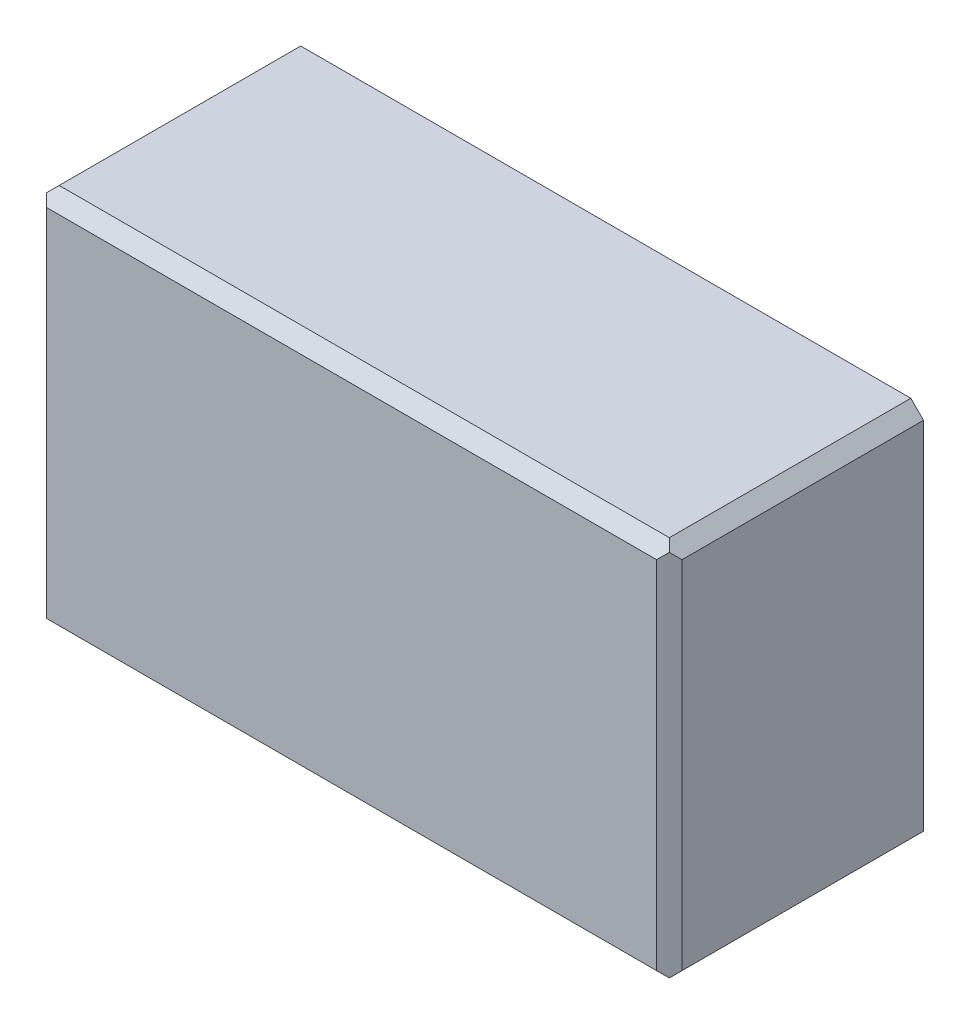
ISO-10303-21;
HEADER;
FILE_DESCRIPTION(('STEP AP214'),'2;1');
FILE_NAME('part.step','',(''),(''),'','','');
FILE_SCHEMA(('AUTOMOTIVE_DESIGN { 1 0 10303 214 1 1 1 1 }'));
ENDSEC;
DATA;
#1=APPLICATION_CONTEXT('core data for automotive mechanical design processes');
#2=APPLICATION_PROTOCOL_DEFINITION('international standard','automotive_design',2000,#1);
#3=PRODUCT_CONTEXT('',#1,'mechanical');
#4=PRODUCT('Part','Part','',(#3));
#5=PRODUCT_RELATED_PRODUCT_CATEGORY('part','',(#4));
#6=PRODUCT_DEFINITION_FORMATION('','',#4);
#7=PRODUCT_DEFINITION_CONTEXT('part definition',#1,'design');
#8=PRODUCT_DEFINITION('design','',#6,#7);
#9=PRODUCT_DEFINITION_SHAPE('','',#8);
#10=(LENGTH_UNIT() NAMED_UNIT(*) SI_UNIT(.MILLI.,.METRE.));
#11=(NAMED_UNIT(*) PLANE_ANGLE_UNIT() SI_UNIT($,.RADIAN.));
#12=(NAMED_UNIT(*) SI_UNIT($,.STERADIAN.) SOLID_ANGLE_UNIT());
#13=UNCERTAINTY_MEASURE_WITH_UNIT(LENGTH_MEASURE(1.E-05),#10,'distance_accuracy_value','');
#14=(GEOMETRIC_REPRESENTATION_CONTEXT(3) GLOBAL_UNCERTAINTY_ASSIGNED_CONTEXT((#13)) GLOBAL_UNIT_ASSIGNED_CONTEXT((#10,
#11,#12)) REPRESENTATION_CONTEXT('',''));
#15=CARTESIAN_POINT('',(0.,0.,0.));
#16=DIRECTION('',(0.,0.,1.));
#17=DIRECTION('',(1.,0.,0.));
#18=AXIS2_PLACEMENT_3D('',#15,#16,#17);
#19=CARTESIAN_POINT('',(0.,0.,0.0862));
#20=DIRECTION('',(0.,0.,-1.));
#21=DIRECTION('',(-1.,0.,0.));
#22=AXIS2_PLACEMENT_3D('',#19,#20,#21);
#23=PLANE('',#22);
#24=DIRECTION('',(1.,0.,0.));
#25=VECTOR('',#24,1.);
#26=CARTESIAN_POINT('',(-0.4159973957868,0.25,0.0862));
#27=LINE('',#26,#25);
#28=CARTESIAN_POINT('',(-0.2159973957868,0.25,0.0862));
#29=VERTEX_POINT('',#28);
#30=CARTESIAN_POINT('',(-0.4159973957868,0.25,0.0862));
#31=VERTEX_POINT('',#30);
#32=EDGE_CURVE('E184',#29,#31,#27,.F.);
#33=ORIENTED_EDGE('',*,*,#32,.F.);
#34=DIRECTION('',(0.,1.,0.));
#35=VECTOR('',#34,1.);
#36=CARTESIAN_POINT('',(-0.2159973957868,0.25,0.0862));
#37=LINE('',#36,#35);
#38=CARTESIAN_POINT('',(-0.2159973957868,-0.25,0.0862));
#39=VERTEX_POINT('',#38);
#40=EDGE_CURVE('E212',#39,#29,#37,.T.);
#41=ORIENTED_EDGE('',*,*,#40,.F.);
#42=DIRECTION('',(1.,0.,0.));
#43=VECTOR('',#42,1.);
#44=CARTESIAN_POINT('',(-0.2159973957868,-0.25,0.0862));
#45=LINE('',#44,#43);
#46=CARTESIAN_POINT('',(-0.4659973957868,-0.25,0.0862));
#47=VERTEX_POINT('',#46);
#48=EDGE_CURVE('E163',#47,#39,#45,.T.);
#49=ORIENTED_EDGE('',*,*,#48,.F.);
#50=DIRECTION('',(0.,1.,0.));
#51=VECTOR('',#50,1.);
#52=CARTESIAN_POINT('',(-0.4659973957868,-0.25,0.0862));
#53=LINE('',#52,#51);
#54=CARTESIAN_POINT('',(-0.4659973957868,0.2,0.0862));
#55=VERTEX_POINT('',#54);
#56=EDGE_CURVE('E157',#55,#47,#53,.F.);
#57=ORIENTED_EDGE('',*,*,#56,.F.);
#58=CARTESIAN_POINT('',(-0.4659973957868,0.25,0.0862));
#59=DIRECTION('',(0.,0.,-1.));
#60=DIRECTION('',(-1.,0.,0.));
#61=AXIS2_PLACEMENT_3D('',#58,#59,#60);
#62=CIRCLE('',#61,0.05);
#63=EDGE_CURVE('E20',#55,#31,#62,.F.);
#64=ORIENTED_EDGE('',*,*,#63,.T.);
#65=EDGE_LOOP('',(#33,#41,#49,#57,#64));
#66=FACE_BOUND('',#65,.T.);
#67=ADVANCED_FACE('F17',(#66),#23,.T.);
#68=CARTESIAN_POINT('',(0.,0.,0.0862));
#69=DIRECTION('',(0.,0.,-1.));
#70=DIRECTION('',(-1.,0.,0.));
#71=AXIS2_PLACEMENT_3D('',#68,#69,#70);
#72=PLANE('',#71);
#73=DIRECTION('',(1.,0.,0.));
#74=VECTOR('',#73,1.);
#75=CARTESIAN_POINT('',(0.1840026042132,0.25,0.0862));
#76=LINE('',#75,#74);
#77=CARTESIAN_POINT('',(0.4340026042132,0.25,0.0862));
#78=VERTEX_POINT('',#77);
#79=CARTESIAN_POINT('',(0.1840026042132,0.25,0.0862));
#80=VERTEX_POINT('',#79);
#81=EDGE_CURVE('E232',#78,#80,#76,.F.);
#82=ORIENTED_EDGE('',*,*,#81,.F.);
#83=DIRECTION('',(0.,1.,0.));
#84=VECTOR('',#83,1.);
#85=CARTESIAN_POINT('',(0.4340026042132,0.25,0.0862));
#86=LINE('',#85,#84);
#87=CARTESIAN_POINT('',(0.4340026042132,-0.25,0.0862));
#88=VERTEX_POINT('',#87);
#89=EDGE_CURVE('E249',#88,#78,#86,.T.);
#90=ORIENTED_EDGE('',*,*,#89,.F.);
#91=DIRECTION('',(1.,0.,0.));
#92=VECTOR('',#91,1.);
#93=CARTESIAN_POINT('',(0.4340026042132,-0.25,0.0862));
#94=LINE('',#93,#92);
#95=CARTESIAN_POINT('',(0.1840026042132,-0.25,0.0862));
#96=VERTEX_POINT('',#95);
#97=EDGE_CURVE('E247',#96,#88,#94,.T.);
#98=ORIENTED_EDGE('',*,*,#97,.F.);
#99=DIRECTION('',(0.,1.,0.));
#100=VECTOR('',#99,1.);
#101=CARTESIAN_POINT('',(0.1840026042132,-0.25,0.0862));
#102=LINE('',#101,#100);
#103=EDGE_CURVE('E241',#80,#96,#102,.F.);
#104=ORIENTED_EDGE('',*,*,#103,.F.);
#105=EDGE_LOOP('',(#82,#90,#98,#104));
#106=FACE_BOUND('',#105,.T.);
#107=ADVANCED_FACE('F273',(#106),#72,.T.);
#108=CARTESIAN_POINT('',(-0.2159973957868,0.25,0.1262));
#109=DIRECTION('',(1.,0.,0.));
#110=DIRECTION('',(0.,0.,-1.));
#111=AXIS2_PLACEMENT_3D('',#108,#109,#110);
#112=PLANE('',#111);
#113=DIRECTION('',(0.,0.,1.));
#114=VECTOR('',#113,1.);
#115=CARTESIAN_POINT('',(-0.2159973957868,0.25,0.1262));
#116=LINE('',#115,#114);
#117=CARTESIAN_POINT('',(-0.2159973957868,0.25,0.1262));
#118=VERTEX_POINT('',#117);
#119=EDGE_CURVE('E182',#118,#29,#116,.F.);
#120=ORIENTED_EDGE('',*,*,#119,.F.);
#121=DIRECTION('',(0.,1.,0.));
#122=VECTOR('',#121,1.);
#123=CARTESIAN_POINT('',(-0.2159973957868,0.,0.1262));
#124=LINE('',#123,#122);
#125=CARTESIAN_POINT('',(-0.2159973957868,-0.25,0.1262));
#126=VERTEX_POINT('',#125);
#127=EDGE_CURVE('E194',#118,#126,#124,.F.);
#128=ORIENTED_EDGE('',*,*,#127,.T.);
#129=DIRECTION('',(0.,0.,-1.));
#130=VECTOR('',#129,1.);
#131=CARTESIAN_POINT('',(-0.2159973957868,-0.25,0.1262));
#132=LINE('',#131,#130);
#133=EDGE_CURVE('E168',#39,#126,#132,.F.);
#134=ORIENTED_EDGE('',*,*,#133,.F.);
#135=ORIENTED_EDGE('',*,*,#40,.T.);
#136=EDGE_LOOP('',(#120,#128,#134,#135));
#137=FACE_BOUND('',#136,.T.);
#138=ADVANCED_FACE('F262',(#137),#112,.T.);
#139=CARTESIAN_POINT('',(-0.2159973957868,-0.25,0.1262));
#140=DIRECTION('',(0.,-1.,0.));
#141=DIRECTION('',(0.,0.,-1.));
#142=AXIS2_PLACEMENT_3D('',#139,#140,#141);
#143=PLANE('',#142);
#144=ORIENTED_EDGE('',*,*,#133,.T.);
#145=DIRECTION('',(1.,0.,0.));
#146=VECTOR('',#145,1.);
#147=CARTESIAN_POINT('',(0.,-0.25,0.1262));
#148=LINE('',#147,#146);
#149=CARTESIAN_POINT('',(-0.4659973957868,-0.25,0.1262));
#150=VERTEX_POINT('',#149);
#151=EDGE_CURVE('E196',#126,#150,#148,.F.);
#152=ORIENTED_EDGE('',*,*,#151,.T.);
#153=DIRECTION('',(0.,0.,1.));
#154=VECTOR('',#153,1.);
#155=CARTESIAN_POINT('',(-0.4659973957868,-0.25,0.1262));
#156=LINE('',#155,#154);
#157=EDGE_CURVE('E167',#47,#150,#156,.T.);
#158=ORIENTED_EDGE('',*,*,#157,.F.);
#159=ORIENTED_EDGE('',*,*,#48,.T.);
#160=EDGE_LOOP('',(#144,#152,#158,#159));
#161=FACE_BOUND('',#160,.T.);
#162=ADVANCED_FACE('F264',(#161),#143,.T.);
#163=CARTESIAN_POINT('',(-0.4659973957868,-0.25,0.1262));
#164=DIRECTION('',(-1.,0.,0.));
#165=DIRECTION('',(0.,0.,1.));
#166=AXIS2_PLACEMENT_3D('',#163,#164,#165);
#167=PLANE('',#166);
#168=ORIENTED_EDGE('',*,*,#157,.T.);
#169=DIRECTION('',(0.,1.,0.));
#170=VECTOR('',#169,1.);
#171=CARTESIAN_POINT('',(-0.4659973957868,0.,0.1262));
#172=LINE('',#171,#170);
#173=CARTESIAN_POINT('',(-0.4659973957868,0.2,0.1262));
#174=VERTEX_POINT('',#173);
#175=EDGE_CURVE('E174',#150,#174,#172,.T.);
#176=ORIENTED_EDGE('',*,*,#175,.T.);
#177=DIRECTION('',(0.,0.,-1.));
#178=VECTOR('',#177,1.);
#179=CARTESIAN_POINT('',(-0.4659973957868,0.2,0.1262));
#180=LINE('',#179,#178);
#181=EDGE_CURVE('E171',#174,#55,#180,.T.);
#182=ORIENTED_EDGE('',*,*,#181,.T.);
#183=ORIENTED_EDGE('',*,*,#56,.T.);
#184=EDGE_LOOP('',(#168,#176,#182,#183));
#185=FACE_BOUND('',#184,.T.);
#186=ADVANCED_FACE('F172',(#185),#167,.T.);
#187=CARTESIAN_POINT('',(-0.4659973957868,0.25,0.1262));
#188=DIRECTION('',(0.,0.,-1.));
#189=DIRECTION('',(-1.,0.,0.));
#190=AXIS2_PLACEMENT_3D('',#187,#188,#189);
#191=CYLINDRICAL_SURFACE('',#190,0.05);
#192=ORIENTED_EDGE('',*,*,#63,.F.);
#193=ORIENTED_EDGE('',*,*,#181,.F.);
#194=CARTESIAN_POINT('',(-0.4659973957868,0.25,0.1262));
#195=DIRECTION('',(0.,0.,-1.));
#196=DIRECTION('',(-1.,0.,0.));
#197=AXIS2_PLACEMENT_3D('',#194,#195,#196);
#198=CIRCLE('',#197,0.05);
#199=CARTESIAN_POINT('',(-0.4159973957868,0.25,0.1262));
#200=VERTEX_POINT('',#199);
#201=EDGE_CURVE('E220',#174,#200,#198,.F.);
#202=ORIENTED_EDGE('',*,*,#201,.T.);
#203=DIRECTION('',(0.,0.,1.));
#204=VECTOR('',#203,1.);
#205=CARTESIAN_POINT('',(-0.4159973957868,0.25,0.1262));
#206=LINE('',#205,#204);
#207=EDGE_CURVE('E180',#31,#200,#206,.T.);
#208=ORIENTED_EDGE('',*,*,#207,.F.);
#209=EDGE_LOOP('',(#192,#193,#202,#208));
#210=FACE_BOUND('',#209,.T.);
#211=ADVANCED_FACE('F178',(#210),#191,.F.);
#212=CARTESIAN_POINT('',(-0.4159973957868,0.25,0.1262));
#213=DIRECTION('',(0.,1.,0.));
#214=DIRECTION('',(0.,0.,1.));
#215=AXIS2_PLACEMENT_3D('',#212,#213,#214);
#216=PLANE('',#215);
#217=ORIENTED_EDGE('',*,*,#207,.T.);
#218=DIRECTION('',(1.,0.,0.));
#219=VECTOR('',#218,1.);
#220=CARTESIAN_POINT('',(0.,0.25,0.1262));
#221=LINE('',#220,#219);
#222=EDGE_CURVE('E221',#200,#118,#221,.T.);
#223=ORIENTED_EDGE('',*,*,#222,.T.);
#224=ORIENTED_EDGE('',*,*,#119,.T.);
#225=ORIENTED_EDGE('',*,*,#32,.T.);
#226=EDGE_LOOP('',(#217,#223,#224,#225));
#227=FACE_BOUND('',#226,.T.);
#228=ADVANCED_FACE('F254',(#227),#216,.T.);
#229=CARTESIAN_POINT('',(0.4340026042132,0.25,0.1262));
#230=DIRECTION('',(1.,0.,0.));
#231=DIRECTION('',(0.,0.,-1.));
#232=AXIS2_PLACEMENT_3D('',#229,#230,#231);
#233=PLANE('',#232);
#234=DIRECTION('',(0.,0.,1.));
#235=VECTOR('',#234,1.);
#236=CARTESIAN_POINT('',(0.4340026042132,0.25,0.1262));
#237=LINE('',#236,#235);
#238=CARTESIAN_POINT('',(0.4340026042132,0.25,0.1262));
#239=VERTEX_POINT('',#238);
#240=EDGE_CURVE('E235',#239,#78,#237,.F.);
#241=ORIENTED_EDGE('',*,*,#240,.F.);
#242=DIRECTION('',(0.,1.,0.));
#243=VECTOR('',#242,1.);
#244=CARTESIAN_POINT('',(0.4340026042132,0.,0.1262));
#245=LINE('',#244,#243);
#246=CARTESIAN_POINT('',(0.4340026042132,-0.25,0.1262));
#247=VERTEX_POINT('',#246);
#248=EDGE_CURVE('E222',#239,#247,#245,.F.);
#249=ORIENTED_EDGE('',*,*,#248,.T.);
#250=DIRECTION('',(0.,0.,-1.));
#251=VECTOR('',#250,1.);
#252=CARTESIAN_POINT('',(0.4340026042132,-0.25,0.1262));
#253=LINE('',#252,#251);
#254=EDGE_CURVE('E244',#88,#247,#253,.F.);
#255=ORIENTED_EDGE('',*,*,#254,.F.);
#256=ORIENTED_EDGE('',*,*,#89,.T.);
#257=EDGE_LOOP('',(#241,#249,#255,#256));
#258=FACE_BOUND('',#257,.T.);
#259=ADVANCED_FACE('F344',(#258),#233,.T.);
#260=CARTESIAN_POINT('',(0.4340026042132,-0.25,0.1262));
#261=DIRECTION('',(0.,-1.,0.));
#262=DIRECTION('',(0.,0.,-1.));
#263=AXIS2_PLACEMENT_3D('',#260,#261,#262);
#264=PLANE('',#263);
#265=ORIENTED_EDGE('',*,*,#254,.T.);
#266=DIRECTION('',(1.,0.,0.));
#267=VECTOR('',#266,1.);
#268=CARTESIAN_POINT('',(0.,-0.25,0.1262));
#269=LINE('',#268,#267);
#270=CARTESIAN_POINT('',(0.1840026042132,-0.25,0.1262));
#271=VERTEX_POINT('',#270);
#272=EDGE_CURVE('E513',#247,#271,#269,.F.);
#273=ORIENTED_EDGE('',*,*,#272,.T.);
#274=DIRECTION('',(0.,0.,1.));
#275=VECTOR('',#274,1.);
#276=CARTESIAN_POINT('',(0.1840026042132,-0.25,0.1262));
#277=LINE('',#276,#275);
#278=EDGE_CURVE('E238',#96,#271,#277,.T.);
#279=ORIENTED_EDGE('',*,*,#278,.F.);
#280=ORIENTED_EDGE('',*,*,#97,.T.);
#281=EDGE_LOOP('',(#265,#273,#279,#280));
#282=FACE_BOUND('',#281,.T.);
#283=ADVANCED_FACE('F340',(#282),#264,.T.);
#284=CARTESIAN_POINT('',(0.1840026042132,-0.25,0.1262));
#285=DIRECTION('',(-1.,0.,0.));
#286=DIRECTION('',(0.,0.,1.));
#287=AXIS2_PLACEMENT_3D('',#284,#285,#286);
#288=PLANE('',#287);
#289=ORIENTED_EDGE('',*,*,#278,.T.);
#290=DIRECTION('',(0.,1.,0.));
#291=VECTOR('',#290,1.);
#292=CARTESIAN_POINT('',(0.1840026042132,0.,0.1262));
#293=LINE('',#292,#291);
#294=CARTESIAN_POINT('',(0.1840026042132,0.25,0.1262));
#295=VERTEX_POINT('',#294);
#296=EDGE_CURVE('E517',#271,#295,#293,.T.);
#297=ORIENTED_EDGE('',*,*,#296,.T.);
#298=DIRECTION('',(0.,0.,1.));
#299=VECTOR('',#298,1.);
#300=CARTESIAN_POINT('',(0.1840026042132,0.25,0.1262));
#301=LINE('',#300,#299);
#302=EDGE_CURVE('E197',#80,#295,#301,.T.);
#303=ORIENTED_EDGE('',*,*,#302,.F.);
#304=ORIENTED_EDGE('',*,*,#103,.T.);
#305=EDGE_LOOP('',(#289,#297,#303,#304));
#306=FACE_BOUND('',#305,.T.);
#307=ADVANCED_FACE('F336',(#306),#288,.T.);
#308=CARTESIAN_POINT('',(0.1840026042132,0.25,0.1262));
#309=DIRECTION('',(0.,1.,0.));
#310=DIRECTION('',(0.,0.,1.));
#311=AXIS2_PLACEMENT_3D('',#308,#309,#310);
#312=PLANE('',#311);
#313=ORIENTED_EDGE('',*,*,#302,.T.);
#314=DIRECTION('',(1.,0.,0.));
#315=VECTOR('',#314,1.);
#316=CARTESIAN_POINT('',(0.,0.25,0.1262));
#317=LINE('',#316,#315);
#318=EDGE_CURVE('E510',#295,#239,#317,.T.);
#319=ORIENTED_EDGE('',*,*,#318,.T.);
#320=ORIENTED_EDGE('',*,*,#240,.T.);
#321=ORIENTED_EDGE('',*,*,#81,.T.);
#322=EDGE_LOOP('',(#313,#319,#320,#321));
#323=FACE_BOUND('',#322,.T.);
#324=ADVANCED_FACE('F332',(#323),#312,.T.);
#325=CARTESIAN_POINT('',(0.,0.,0.1262));
#326=DIRECTION('',(0.,0.,1.));
#327=DIRECTION('',(1.,0.,0.));
#328=AXIS2_PLACEMENT_3D('',#325,#326,#327);
#329=PLANE('',#328);
#330=ORIENTED_EDGE('',*,*,#296,.F.);
#331=ORIENTED_EDGE('',*,*,#272,.F.);
#332=ORIENTED_EDGE('',*,*,#248,.F.);
#333=ORIENTED_EDGE('',*,*,#318,.F.);
#334=EDGE_LOOP('',(#330,#331,#332,#333));
#335=FACE_BOUND('',#334,.T.);
#336=ORIENTED_EDGE('',*,*,#201,.F.);
#337=ORIENTED_EDGE('',*,*,#175,.F.);
#338=ORIENTED_EDGE('',*,*,#151,.F.);
#339=ORIENTED_EDGE('',*,*,#127,.F.);
#340=ORIENTED_EDGE('',*,*,#222,.F.);
#341=EDGE_LOOP('',(#336,#337,#338,#339,#340));
#342=FACE_BOUND('',#341,.T.);
#343=DIRECTION('',(0.707106781186548,0.707106781186548,0.));
#344=VECTOR('',#343,1.);
#345=CARTESIAN_POINT('',(0.49,-0.29,0.1262));
#346=LINE('',#345,#344);
#347=CARTESIAN_POINT('',(0.48,-0.3,0.1262));
#348=VERTEX_POINT('',#347);
#349=CARTESIAN_POINT('',(0.5,-0.28,0.1262));
#350=VERTEX_POINT('',#349);
#351=EDGE_CURVE('E552',#348,#350,#346,.T.);
#352=ORIENTED_EDGE('',*,*,#351,.F.);
#353=DIRECTION('',(1.,0.,0.));
#354=VECTOR('',#353,1.);
#355=CARTESIAN_POINT('',(-0.5,-0.3,0.1262));
#356=LINE('',#355,#354);
#357=CARTESIAN_POINT('',(-0.48,-0.3,0.1262));
#358=VERTEX_POINT('',#357);
#359=EDGE_CURVE('E542',#358,#348,#356,.T.);
#360=ORIENTED_EDGE('',*,*,#359,.F.);
#361=DIRECTION('',(0.707106781186548,-0.707106781186548,0.));
#362=VECTOR('',#361,1.);
#363=CARTESIAN_POINT('',(-0.49,-0.29,0.1262));
#364=LINE('',#363,#362);
#365=CARTESIAN_POINT('',(-0.5,-0.28,0.1262));
#366=VERTEX_POINT('',#365);
#367=EDGE_CURVE('E537',#366,#358,#364,.T.);
#368=ORIENTED_EDGE('',*,*,#367,.F.);
#369=DIRECTION('',(0.,1.,0.));
#370=VECTOR('',#369,1.);
#371=CARTESIAN_POINT('',(-0.5,0.3,0.1262));
#372=LINE('',#371,#370);
#373=CARTESIAN_POINT('',(-0.5,0.28,0.1262));
#374=VERTEX_POINT('',#373);
#375=EDGE_CURVE('E532',#374,#366,#372,.F.);
#376=ORIENTED_EDGE('',*,*,#375,.F.);
#377=DIRECTION('',(-0.707106781186548,-0.707106781186548,0.));
#378=VECTOR('',#377,1.);
#379=CARTESIAN_POINT('',(-0.49,0.29,0.1262));
#380=LINE('',#379,#378);
#381=CARTESIAN_POINT('',(-0.48,0.3,0.1262));
#382=VERTEX_POINT('',#381);
#383=EDGE_CURVE('E527',#382,#374,#380,.T.);
#384=ORIENTED_EDGE('',*,*,#383,.F.);
#385=DIRECTION('',(1.,0.,0.));
#386=VECTOR('',#385,1.);
#387=CARTESIAN_POINT('',(0.5,0.3,0.1262));
#388=LINE('',#387,#386);
#389=CARTESIAN_POINT('',(0.48,0.3,0.1262));
#390=VERTEX_POINT('',#389);
#391=EDGE_CURVE('E522',#390,#382,#388,.F.);
#392=ORIENTED_EDGE('',*,*,#391,.F.);
#393=DIRECTION('',(-0.707106781186548,0.707106781186548,0.));
#394=VECTOR('',#393,1.);
#395=CARTESIAN_POINT('',(0.49,0.29,0.1262));
#396=LINE('',#395,#394);
#397=CARTESIAN_POINT('',(0.5,0.28,0.1262));
#398=VERTEX_POINT('',#397);
#399=EDGE_CURVE('E546',#398,#390,#396,.T.);
#400=ORIENTED_EDGE('',*,*,#399,.F.);
#401=DIRECTION('',(0.,1.,0.));
#402=VECTOR('',#401,1.);
#403=CARTESIAN_POINT('',(0.5,-0.3,0.1262));
#404=LINE('',#403,#402);
#405=EDGE_CURVE('E557',#350,#398,#404,.T.);
#406=ORIENTED_EDGE('',*,*,#405,.F.);
#407=EDGE_LOOP('',(#352,#360,#368,#376,#384,#392,#400,#406));
#408=FACE_BOUND('',#407,.T.);
#409=ADVANCED_FACE('F257',(#335,#342,#408),#329,.F.);
#410=CARTESIAN_POINT('',(0.5,0.3,0.0762));
#411=DIRECTION('',(0.,1.,0.));
#412=DIRECTION('',(0.,0.,1.));
#413=AXIS2_PLACEMENT_3D('',#410,#411,#412);
#414=PLANE('',#413);
#415=DIRECTION('',(1.,0.,0.));
#416=VECTOR('',#415,1.);
#417=CARTESIAN_POINT('',(0.,0.3,0.5062));
#418=LINE('',#417,#416);
#419=CARTESIAN_POINT('',(0.48,0.3,0.5062));
#420=VERTEX_POINT('',#419);
#421=CARTESIAN_POINT('',(-0.48,0.3,0.5062));
#422=VERTEX_POINT('',#421);
#423=EDGE_CURVE('E566',#420,#422,#418,.F.);
#424=ORIENTED_EDGE('',*,*,#423,.F.);
#425=DIRECTION('',(0.,0.,1.));
#426=VECTOR('',#425,1.);
#427=CARTESIAN_POINT('',(0.48,0.3,0.3262));
#428=LINE('',#427,#426);
#429=EDGE_CURVE('E544',#390,#420,#428,.T.);
#430=ORIENTED_EDGE('',*,*,#429,.F.);
#431=ORIENTED_EDGE('',*,*,#391,.T.);
#432=DIRECTION('',(0.,0.,1.));
#433=VECTOR('',#432,1.);
#434=CARTESIAN_POINT('',(-0.48,0.3,0.3262));
#435=LINE('',#434,#433);
#436=EDGE_CURVE('E524',#422,#382,#435,.F.);
#437=ORIENTED_EDGE('',*,*,#436,.F.);
#438=EDGE_LOOP('',(#424,#430,#431,#437));
#439=FACE_BOUND('',#438,.T.);
#440=ADVANCED_FACE('F325',(#439),#414,.T.);
#441=CARTESIAN_POINT('',(-0.49,0.29,0.3262));
#442=DIRECTION('',(-0.707106781186548,0.707106781186548,0.));
#443=DIRECTION('',(-0.707106781186548,-0.707106781186548,0.));
#444=AXIS2_PLACEMENT_3D('',#441,#442,#443);
#445=PLANE('',#444);
#446=ORIENTED_EDGE('',*,*,#436,.T.);
#447=ORIENTED_EDGE('',*,*,#383,.T.);
#448=DIRECTION('',(0.,0.,1.));
#449=VECTOR('',#448,1.);
#450=CARTESIAN_POINT('',(-0.5,0.28,0.0762));
#451=LINE('',#450,#449);
#452=CARTESIAN_POINT('',(-0.5,0.28,0.5062));
#453=VERTEX_POINT('',#452);
#454=EDGE_CURVE('E529',#453,#374,#451,.F.);
#455=ORIENTED_EDGE('',*,*,#454,.F.);
#456=DIRECTION('',(-0.577350269189627,-0.577350269189624,-0.577350269189627));
#457=VECTOR('',#456,1.);
#458=CARTESIAN_POINT('',(-0.49,0.29,0.5162));
#459=LINE('',#458,#457);
#460=CARTESIAN_POINT('',(-0.49,0.29,0.5162));
#461=VERTEX_POINT('',#460);
#462=EDGE_CURVE('E576',#461,#453,#459,.T.);
#463=ORIENTED_EDGE('',*,*,#462,.F.);
#464=DIRECTION('',(-0.577350269189624,-0.577350269189627,0.577350269189627));
#465=VECTOR('',#464,1.);
#466=CARTESIAN_POINT('',(-0.48,0.3,0.5062));
#467=LINE('',#466,#465);
#468=EDGE_CURVE('E569',#422,#461,#467,.T.);
#469=ORIENTED_EDGE('',*,*,#468,.F.);
#470=EDGE_LOOP('',(#446,#447,#455,#463,#469));
#471=FACE_BOUND('',#470,.T.);
#472=ADVANCED_FACE('F321',(#471),#445,.T.);
#473=CARTESIAN_POINT('',(-0.5,0.3,0.0762));
#474=DIRECTION('',(-1.,0.,0.));
#475=DIRECTION('',(0.,0.,1.));
#476=AXIS2_PLACEMENT_3D('',#473,#474,#475);
#477=PLANE('',#476);
#478=ORIENTED_EDGE('',*,*,#375,.T.);
#479=DIRECTION('',(0.,0.,1.));
#480=VECTOR('',#479,1.);
#481=CARTESIAN_POINT('',(-0.5,-0.28,0.3262));
#482=LINE('',#481,#480);
#483=CARTESIAN_POINT('',(-0.5,-0.28,0.5062));
#484=VERTEX_POINT('',#483);
#485=EDGE_CURVE('E534',#484,#366,#482,.F.);
#486=ORIENTED_EDGE('',*,*,#485,.F.);
#487=DIRECTION('',(0.,1.,0.));
#488=VECTOR('',#487,1.);
#489=CARTESIAN_POINT('',(-0.5,0.,0.5062));
#490=LINE('',#489,#488);
#491=EDGE_CURVE('E579',#453,#484,#490,.F.);
#492=ORIENTED_EDGE('',*,*,#491,.F.);
#493=ORIENTED_EDGE('',*,*,#454,.T.);
#494=EDGE_LOOP('',(#478,#486,#492,#493));
#495=FACE_BOUND('',#494,.T.);
#496=ADVANCED_FACE('F317',(#495),#477,.T.);
#497=CARTESIAN_POINT('',(-0.49,-0.29,0.3262));
#498=DIRECTION('',(-0.707106781186548,-0.707106781186548,0.));
#499=DIRECTION('',(0.707106781186548,-0.707106781186548,0.));
#500=AXIS2_PLACEMENT_3D('',#497,#498,#499);
#501=PLANE('',#500);
#502=ORIENTED_EDGE('',*,*,#485,.T.);
#503=ORIENTED_EDGE('',*,*,#367,.T.);
#504=DIRECTION('',(0.,0.,-1.));
#505=VECTOR('',#504,1.);
#506=CARTESIAN_POINT('',(-0.48,-0.3,0.0762));
#507=LINE('',#506,#505);
#508=CARTESIAN_POINT('',(-0.48,-0.3,0.5062));
#509=VERTEX_POINT('',#508);
#510=EDGE_CURVE('E539',#509,#358,#507,.T.);
#511=ORIENTED_EDGE('',*,*,#510,.F.);
#512=DIRECTION('',(0.577350269189624,-0.577350269189627,-0.577350269189627));
#513=VECTOR('',#512,1.);
#514=CARTESIAN_POINT('',(-0.49,-0.29,0.5162));
#515=LINE('',#514,#513);
#516=CARTESIAN_POINT('',(-0.49,-0.29,0.5162));
#517=VERTEX_POINT('',#516);
#518=EDGE_CURVE('E587',#517,#509,#515,.T.);
#519=ORIENTED_EDGE('',*,*,#518,.F.);
#520=DIRECTION('',(0.577350269189627,-0.577350269189624,0.577350269189627));
#521=VECTOR('',#520,1.);
#522=CARTESIAN_POINT('',(-0.5,-0.28,0.5062));
#523=LINE('',#522,#521);
#524=EDGE_CURVE('E571',#484,#517,#523,.T.);
#525=ORIENTED_EDGE('',*,*,#524,.F.);
#526=EDGE_LOOP('',(#502,#503,#511,#519,#525));
#527=FACE_BOUND('',#526,.T.);
#528=ADVANCED_FACE('F313',(#527),#501,.T.);
#529=CARTESIAN_POINT('',(-0.5,-0.3,0.0762));
#530=DIRECTION('',(0.,-1.,0.));
#531=DIRECTION('',(0.,0.,-1.));
#532=AXIS2_PLACEMENT_3D('',#529,#530,#531);
#533=PLANE('',#532);
#534=ORIENTED_EDGE('',*,*,#359,.T.);
#535=DIRECTION('',(0.,0.,1.));
#536=VECTOR('',#535,1.);
#537=CARTESIAN_POINT('',(0.48,-0.3,0.3262));
#538=LINE('',#537,#536);
#539=CARTESIAN_POINT('',(0.48,-0.3,0.5062));
#540=VERTEX_POINT('',#539);
#541=EDGE_CURVE('E549',#540,#348,#538,.F.);
#542=ORIENTED_EDGE('',*,*,#541,.F.);
#543=DIRECTION('',(1.,0.,0.));
#544=VECTOR('',#543,1.);
#545=CARTESIAN_POINT('',(0.,-0.3,0.5062));
#546=LINE('',#545,#544);
#547=EDGE_CURVE('E590',#509,#540,#546,.T.);
#548=ORIENTED_EDGE('',*,*,#547,.F.);
#549=ORIENTED_EDGE('',*,*,#510,.T.);
#550=EDGE_LOOP('',(#534,#542,#548,#549));
#551=FACE_BOUND('',#550,.T.);
#552=ADVANCED_FACE('F309',(#551),#533,.T.);
#553=CARTESIAN_POINT('',(0.49,0.29,0.3262));
#554=DIRECTION('',(0.707106781186548,0.707106781186548,0.));
#555=DIRECTION('',(-0.707106781186548,0.707106781186548,0.));
#556=AXIS2_PLACEMENT_3D('',#553,#554,#555);
#557=PLANE('',#556);
#558=DIRECTION('',(0.,0.,-1.));
#559=VECTOR('',#558,1.);
#560=CARTESIAN_POINT('',(0.5,0.28,0.0762));
#561=LINE('',#560,#559);
#562=CARTESIAN_POINT('',(0.5,0.28,0.5062));
#563=VERTEX_POINT('',#562);
#564=EDGE_CURVE('E560',#398,#563,#561,.F.);
#565=ORIENTED_EDGE('',*,*,#564,.F.);
#566=ORIENTED_EDGE('',*,*,#399,.T.);
#567=ORIENTED_EDGE('',*,*,#429,.T.);
#568=DIRECTION('',(-0.577350269189624,0.577350269189627,-0.577350269189627));
#569=VECTOR('',#568,1.);
#570=CARTESIAN_POINT('',(0.49,0.29,0.5162));
#571=LINE('',#570,#569);
#572=CARTESIAN_POINT('',(0.49,0.29,0.5162));
#573=VERTEX_POINT('',#572);
#574=EDGE_CURVE('E563',#573,#420,#571,.T.);
#575=ORIENTED_EDGE('',*,*,#574,.F.);
#576=DIRECTION('',(-0.577350269189627,0.577350269189624,0.577350269189627));
#577=VECTOR('',#576,1.);
#578=CARTESIAN_POINT('',(0.5,0.28,0.5062));
#579=LINE('',#578,#577);
#580=EDGE_CURVE('E593',#563,#573,#579,.T.);
#581=ORIENTED_EDGE('',*,*,#580,.F.);
#582=EDGE_LOOP('',(#565,#566,#567,#575,#581));
#583=FACE_BOUND('',#582,.T.);
#584=ADVANCED_FACE('F305',(#583),#557,.T.);
#585=CARTESIAN_POINT('',(0.49,-0.29,0.3262));
#586=DIRECTION('',(0.707106781186548,-0.707106781186548,0.));
#587=DIRECTION('',(0.707106781186548,0.707106781186548,0.));
#588=AXIS2_PLACEMENT_3D('',#585,#586,#587);
#589=PLANE('',#588);
#590=ORIENTED_EDGE('',*,*,#541,.T.);
#591=ORIENTED_EDGE('',*,*,#351,.T.);
#592=DIRECTION('',(0.,0.,-1.));
#593=VECTOR('',#592,1.);
#594=CARTESIAN_POINT('',(0.5,-0.28,0.0762));
#595=LINE('',#594,#593);
#596=CARTESIAN_POINT('',(0.5,-0.28,0.5062));
#597=VERTEX_POINT('',#596);
#598=EDGE_CURVE('E554',#597,#350,#595,.T.);
#599=ORIENTED_EDGE('',*,*,#598,.F.);
#600=DIRECTION('',(0.577350269189627,0.577350269189624,-0.577350269189627));
#601=VECTOR('',#600,1.);
#602=CARTESIAN_POINT('',(0.49,-0.29,0.5162));
#603=LINE('',#602,#601);
#604=CARTESIAN_POINT('',(0.49,-0.29,0.5162));
#605=VERTEX_POINT('',#604);
#606=EDGE_CURVE('E600',#605,#597,#603,.T.);
#607=ORIENTED_EDGE('',*,*,#606,.F.);
#608=DIRECTION('',(0.577350269189624,0.577350269189627,0.577350269189627));
#609=VECTOR('',#608,1.);
#610=CARTESIAN_POINT('',(0.48,-0.3,0.5062));
#611=LINE('',#610,#609);
#612=EDGE_CURVE('E582',#540,#605,#611,.T.);
#613=ORIENTED_EDGE('',*,*,#612,.F.);
#614=EDGE_LOOP('',(#590,#591,#599,#607,#613));
#615=FACE_BOUND('',#614,.T.);
#616=ADVANCED_FACE('F301',(#615),#589,.T.);
#617=CARTESIAN_POINT('',(0.5,-0.3,0.0762));
#618=DIRECTION('',(1.,0.,0.));
#619=DIRECTION('',(0.,0.,-1.));
#620=AXIS2_PLACEMENT_3D('',#617,#618,#619);
#621=PLANE('',#620);
#622=ORIENTED_EDGE('',*,*,#405,.T.);
#623=ORIENTED_EDGE('',*,*,#564,.T.);
#624=DIRECTION('',(0.,1.,0.));
#625=VECTOR('',#624,1.);
#626=CARTESIAN_POINT('',(0.5,0.,0.5062));
#627=LINE('',#626,#625);
#628=EDGE_CURVE('E603',#597,#563,#627,.T.);
#629=ORIENTED_EDGE('',*,*,#628,.F.);
#630=ORIENTED_EDGE('',*,*,#598,.T.);
#631=EDGE_LOOP('',(#622,#623,#629,#630));
#632=FACE_BOUND('',#631,.T.);
#633=ADVANCED_FACE('F297',(#632),#621,.T.);
#634=CARTESIAN_POINT('',(0.,0.29,0.5162));
#635=DIRECTION('',(0.,0.707106781186548,0.707106781186548));
#636=DIRECTION('',(0.,-0.707106781186548,0.707106781186548));
#637=AXIS2_PLACEMENT_3D('',#634,#635,#636);
#638=PLANE('',#637);
#639=DIRECTION('',(-0.577350269189627,0.577350269189624,-0.577350269189627));
#640=VECTOR('',#639,1.);
#641=CARTESIAN_POINT('',(-0.48,0.28,0.5262));
#642=LINE('',#641,#640);
#643=CARTESIAN_POINT('',(-0.48,0.28,0.5262));
#644=VERTEX_POINT('',#643);
#645=EDGE_CURVE('E573',#644,#461,#642,.T.);
#646=ORIENTED_EDGE('',*,*,#645,.F.);
#647=DIRECTION('',(1.,0.,0.));
#648=VECTOR('',#647,1.);
#649=CARTESIAN_POINT('',(0.,0.28,0.5262));
#650=LINE('',#649,#648);
#651=CARTESIAN_POINT('',(0.48,0.28,0.5262));
#652=VERTEX_POINT('',#651);
#653=EDGE_CURVE('E606',#652,#644,#650,.F.);
#654=ORIENTED_EDGE('',*,*,#653,.F.);
#655=DIRECTION('',(-0.577350269189627,-0.577350269189624,0.577350269189627));
#656=VECTOR('',#655,1.);
#657=CARTESIAN_POINT('',(0.49,0.29,0.5162));
#658=LINE('',#657,#656);
#659=EDGE_CURVE('E596',#573,#652,#658,.T.);
#660=ORIENTED_EDGE('',*,*,#659,.F.);
#661=ORIENTED_EDGE('',*,*,#574,.T.);
#662=ORIENTED_EDGE('',*,*,#423,.T.);
#663=ORIENTED_EDGE('',*,*,#468,.T.);
#664=EDGE_LOOP('',(#646,#654,#660,#661,#662,#663));
#665=FACE_BOUND('',#664,.T.);
#666=ADVANCED_FACE('F293',(#665),#638,.T.);
#667=CARTESIAN_POINT('',(-0.49,0.,0.5162));
#668=DIRECTION('',(-0.707106781186548,0.,0.707106781186548));
#669=DIRECTION('',(0.707106781186548,0.,0.707106781186548));
#670=AXIS2_PLACEMENT_3D('',#667,#668,#669);
#671=PLANE('',#670);
#672=ORIENTED_EDGE('',*,*,#462,.T.);
#673=ORIENTED_EDGE('',*,*,#491,.T.);
#674=ORIENTED_EDGE('',*,*,#524,.T.);
#675=DIRECTION('',(-0.577350269189624,-0.577350269189627,-0.577350269189627));
#676=VECTOR('',#675,1.);
#677=CARTESIAN_POINT('',(-0.48,-0.28,0.5262));
#678=LINE('',#677,#676);
#679=CARTESIAN_POINT('',(-0.48,-0.28,0.5262));
#680=VERTEX_POINT('',#679);
#681=EDGE_CURVE('E584',#680,#517,#678,.T.);
#682=ORIENTED_EDGE('',*,*,#681,.F.);
#683=DIRECTION('',(0.,1.,0.));
#684=VECTOR('',#683,1.);
#685=CARTESIAN_POINT('',(-0.48,0.,0.5262));
#686=LINE('',#685,#684);
#687=EDGE_CURVE('E609',#644,#680,#686,.F.);
#688=ORIENTED_EDGE('',*,*,#687,.F.);
#689=ORIENTED_EDGE('',*,*,#645,.T.);
#690=EDGE_LOOP('',(#672,#673,#674,#682,#688,#689));
#691=FACE_BOUND('',#690,.T.);
#692=ADVANCED_FACE('F290',(#691),#671,.T.);
#693=CARTESIAN_POINT('',(0.,-0.29,0.5162));
#694=DIRECTION('',(0.,-0.707106781186548,0.707106781186548));
#695=DIRECTION('',(0.,-0.707106781186548,-0.707106781186548));
#696=AXIS2_PLACEMENT_3D('',#693,#694,#695);
#697=PLANE('',#696);
#698=ORIENTED_EDGE('',*,*,#518,.T.);
#699=ORIENTED_EDGE('',*,*,#547,.T.);
#700=ORIENTED_EDGE('',*,*,#612,.T.);
#701=DIRECTION('',(0.577350269189627,-0.577350269189624,-0.577350269189627));
#702=VECTOR('',#701,1.);
#703=CARTESIAN_POINT('',(0.48,-0.28,0.5262));
#704=LINE('',#703,#702);
#705=CARTESIAN_POINT('',(0.48,-0.28,0.5262));
#706=VERTEX_POINT('',#705);
#707=EDGE_CURVE('E35',#706,#605,#704,.T.);
#708=ORIENTED_EDGE('',*,*,#707,.F.);
#709=DIRECTION('',(1.,0.,0.));
#710=VECTOR('',#709,1.);
#711=CARTESIAN_POINT('',(0.,-0.28,0.5262));
#712=LINE('',#711,#710);
#713=EDGE_CURVE('E26',#680,#706,#712,.T.);
#714=ORIENTED_EDGE('',*,*,#713,.F.);
#715=ORIENTED_EDGE('',*,*,#681,.T.);
#716=EDGE_LOOP('',(#698,#699,#700,#708,#714,#715));
#717=FACE_BOUND('',#716,.T.);
#718=ADVANCED_FACE('F283',(#717),#697,.T.);
#719=CARTESIAN_POINT('',(0.49,0.,0.5162));
#720=DIRECTION('',(0.707106781186548,0.,0.707106781186548));
#721=DIRECTION('',(0.707106781186548,0.,-0.707106781186548));
#722=AXIS2_PLACEMENT_3D('',#719,#720,#721);
#723=PLANE('',#722);
#724=ORIENTED_EDGE('',*,*,#606,.T.);
#725=ORIENTED_EDGE('',*,*,#628,.T.);
#726=ORIENTED_EDGE('',*,*,#580,.T.);
#727=ORIENTED_EDGE('',*,*,#659,.T.);
#728=DIRECTION('',(0.,1.,0.));
#729=VECTOR('',#728,1.);
#730=CARTESIAN_POINT('',(0.48,0.,0.5262));
#731=LINE('',#730,#729);
#732=EDGE_CURVE('E11',#706,#652,#731,.T.);
#733=ORIENTED_EDGE('',*,*,#732,.F.);
#734=ORIENTED_EDGE('',*,*,#707,.T.);
#735=EDGE_LOOP('',(#724,#725,#726,#727,#733,#734));
#736=FACE_BOUND('',#735,.T.);
#737=ADVANCED_FACE('F277',(#736),#723,.T.);
#738=CARTESIAN_POINT('',(0.,0.,0.5262));
#739=DIRECTION('',(0.,0.,1.));
#740=DIRECTION('',(1.,0.,0.));
#741=AXIS2_PLACEMENT_3D('',#738,#739,#740);
#742=PLANE('',#741);
#743=ORIENTED_EDGE('',*,*,#713,.T.);
#744=ORIENTED_EDGE('',*,*,#732,.T.);
#745=ORIENTED_EDGE('',*,*,#653,.T.);
#746=ORIENTED_EDGE('',*,*,#687,.T.);
#747=EDGE_LOOP('',(#743,#744,#745,#746));
#748=FACE_BOUND('',#747,.T.);
#749=ADVANCED_FACE('F275',(#748),#742,.T.);
#750=CLOSED_SHELL('',(#67,#107,#138,#162,#186,#211,#228,#259,#283,#307,#324,#409,#440,#472,#496,
#528,#552,#584,#616,#633,#666,#692,#718,#737,#749));
#751=MANIFOLD_SOLID_BREP('B1',#750);
#752=ADVANCED_BREP_SHAPE_REPRESENTATION('',(#18,#751),#14);
#753=SHAPE_DEFINITION_REPRESENTATION(#9,#752);
ENDSEC;
END-ISO-10303-21;
